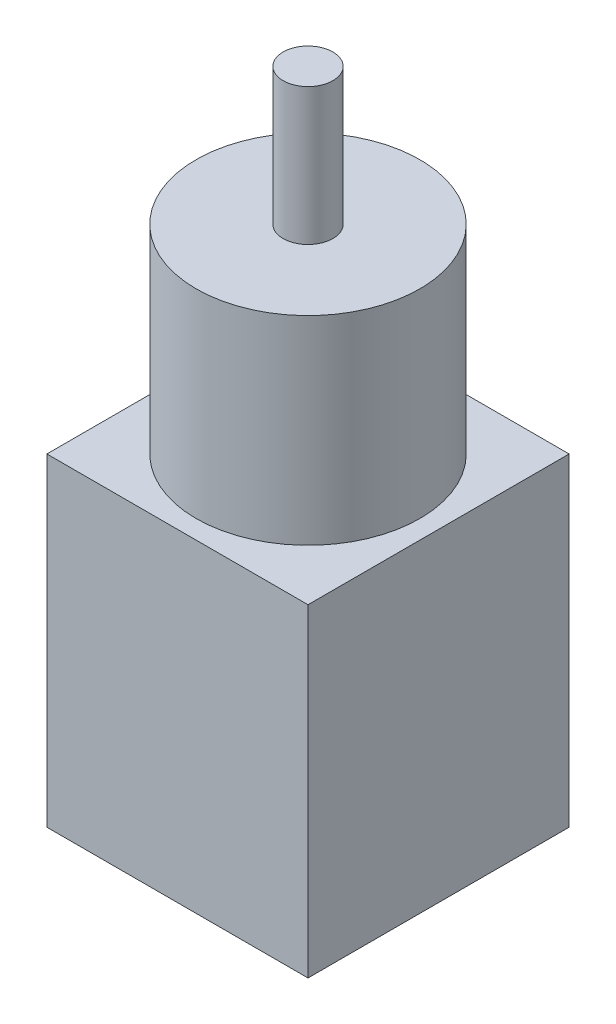
ISO-10303-21;
HEADER;
FILE_DESCRIPTION(('STEP AP214'),'2;1');
FILE_NAME('part.step','',(''),(''),'','','');
FILE_SCHEMA(('AUTOMOTIVE_DESIGN { 1 0 10303 214 1 1 1 1 }'));
ENDSEC;
DATA;
#1=APPLICATION_CONTEXT('core data for automotive mechanical design processes');
#2=APPLICATION_PROTOCOL_DEFINITION('international standard','automotive_design',2000,#1);
#3=PRODUCT_CONTEXT('',#1,'mechanical');
#4=PRODUCT('Part','Part','',(#3));
#5=PRODUCT_RELATED_PRODUCT_CATEGORY('part','',(#4));
#6=PRODUCT_DEFINITION_FORMATION('','',#4);
#7=PRODUCT_DEFINITION_CONTEXT('part definition',#1,'design');
#8=PRODUCT_DEFINITION('design','',#6,#7);
#9=PRODUCT_DEFINITION_SHAPE('','',#8);
#10=(LENGTH_UNIT() NAMED_UNIT(*) SI_UNIT(.MILLI.,.METRE.));
#11=(NAMED_UNIT(*) PLANE_ANGLE_UNIT() SI_UNIT($,.RADIAN.));
#12=(NAMED_UNIT(*) SI_UNIT($,.STERADIAN.) SOLID_ANGLE_UNIT());
#13=UNCERTAINTY_MEASURE_WITH_UNIT(LENGTH_MEASURE(1.E-05),#10,'distance_accuracy_value','');
#14=(GEOMETRIC_REPRESENTATION_CONTEXT(3) GLOBAL_UNCERTAINTY_ASSIGNED_CONTEXT((#13)) GLOBAL_UNIT_ASSIGNED_CONTEXT((#10,
#11,#12)) REPRESENTATION_CONTEXT('',''));
#15=CARTESIAN_POINT('',(0.,0.,0.));
#16=DIRECTION('',(0.,0.,1.));
#17=DIRECTION('',(1.,0.,0.));
#18=AXIS2_PLACEMENT_3D('',#15,#16,#17);
#19=CARTESIAN_POINT('',(21.,52.,21.));
#20=DIRECTION('',(-1.,0.,0.));
#21=DIRECTION('',(0.,0.,1.));
#22=AXIS2_PLACEMENT_3D('',#19,#20,#21);
#23=PLANE('',#22);
#24=DIRECTION('',(0.,0.,-1.));
#25=VECTOR('',#24,1.);
#26=CARTESIAN_POINT('',(21.,0.,21.));
#27=LINE('',#26,#25);
#28=CARTESIAN_POINT('',(21.,0.,21.));
#29=VERTEX_POINT('',#28);
#30=CARTESIAN_POINT('',(21.,0.,-21.));
#31=VERTEX_POINT('',#30);
#32=EDGE_CURVE('E100',#29,#31,#27,.T.);
#33=ORIENTED_EDGE('',*,*,#32,.T.);
#34=DIRECTION('',(0.,-1.,0.));
#35=VECTOR('',#34,1.);
#36=CARTESIAN_POINT('',(21.,52.,-21.));
#37=LINE('',#36,#35);
#38=CARTESIAN_POINT('',(21.,52.,-21.));
#39=VERTEX_POINT('',#38);
#40=EDGE_CURVE('E36',#39,#31,#37,.T.);
#41=ORIENTED_EDGE('',*,*,#40,.F.);
#42=DIRECTION('',(0.,0.,-1.));
#43=VECTOR('',#42,1.);
#44=CARTESIAN_POINT('',(21.,52.,21.));
#45=LINE('',#44,#43);
#46=CARTESIAN_POINT('',(21.,52.,21.));
#47=VERTEX_POINT('',#46);
#48=EDGE_CURVE('E87',#47,#39,#45,.T.);
#49=ORIENTED_EDGE('',*,*,#48,.F.);
#50=DIRECTION('',(0.,-1.,0.));
#51=VECTOR('',#50,1.);
#52=CARTESIAN_POINT('',(21.,52.,21.));
#53=LINE('',#52,#51);
#54=EDGE_CURVE('E96',#47,#29,#53,.T.);
#55=ORIENTED_EDGE('',*,*,#54,.T.);
#56=EDGE_LOOP('',(#33,#41,#49,#55));
#57=FACE_BOUND('',#56,.T.);
#58=ADVANCED_FACE('F33',(#57),#23,.F.);
#59=CARTESIAN_POINT('',(-21.,52.,-21.));
#60=DIRECTION('',(0.,0.,1.));
#61=DIRECTION('',(1.,0.,0.));
#62=AXIS2_PLACEMENT_3D('',#59,#60,#61);
#63=PLANE('',#62);
#64=DIRECTION('',(-1.,0.,0.));
#65=VECTOR('',#64,1.);
#66=CARTESIAN_POINT('',(-21.,0.,-21.));
#67=LINE('',#66,#65);
#68=CARTESIAN_POINT('',(-21.,0.,-21.));
#69=VERTEX_POINT('',#68);
#70=EDGE_CURVE('E92',#31,#69,#67,.T.);
#71=ORIENTED_EDGE('',*,*,#70,.T.);
#72=DIRECTION('',(0.,-1.,0.));
#73=VECTOR('',#72,1.);
#74=CARTESIAN_POINT('',(-21.,52.,-21.));
#75=LINE('',#74,#73);
#76=CARTESIAN_POINT('',(-21.,52.,-21.));
#77=VERTEX_POINT('',#76);
#78=EDGE_CURVE('E90',#77,#69,#75,.T.);
#79=ORIENTED_EDGE('',*,*,#78,.F.);
#80=DIRECTION('',(-1.,0.,0.));
#81=VECTOR('',#80,1.);
#82=CARTESIAN_POINT('',(-21.,52.,-21.));
#83=LINE('',#82,#81);
#84=EDGE_CURVE('E82',#39,#77,#83,.T.);
#85=ORIENTED_EDGE('',*,*,#84,.F.);
#86=ORIENTED_EDGE('',*,*,#40,.T.);
#87=EDGE_LOOP('',(#71,#79,#85,#86));
#88=FACE_BOUND('',#87,.T.);
#89=ADVANCED_FACE('F91',(#88),#63,.F.);
#90=CARTESIAN_POINT('',(-21.,52.,21.));
#91=DIRECTION('',(1.,0.,0.));
#92=DIRECTION('',(0.,0.,-1.));
#93=AXIS2_PLACEMENT_3D('',#90,#91,#92);
#94=PLANE('',#93);
#95=DIRECTION('',(0.,0.,1.));
#96=VECTOR('',#95,1.);
#97=CARTESIAN_POINT('',(-21.,0.,21.));
#98=LINE('',#97,#96);
#99=CARTESIAN_POINT('',(-21.,0.,21.));
#100=VERTEX_POINT('',#99);
#101=EDGE_CURVE('E68',#69,#100,#98,.T.);
#102=ORIENTED_EDGE('',*,*,#101,.T.);
#103=DIRECTION('',(0.,-1.,0.));
#104=VECTOR('',#103,1.);
#105=CARTESIAN_POINT('',(-21.,52.,21.));
#106=LINE('',#105,#104);
#107=CARTESIAN_POINT('',(-21.,52.,21.));
#108=VERTEX_POINT('',#107);
#109=EDGE_CURVE('E93',#108,#100,#106,.T.);
#110=ORIENTED_EDGE('',*,*,#109,.F.);
#111=DIRECTION('',(0.,0.,1.));
#112=VECTOR('',#111,1.);
#113=CARTESIAN_POINT('',(-21.,52.,21.));
#114=LINE('',#113,#112);
#115=EDGE_CURVE('E85',#77,#108,#114,.T.);
#116=ORIENTED_EDGE('',*,*,#115,.F.);
#117=ORIENTED_EDGE('',*,*,#78,.T.);
#118=EDGE_LOOP('',(#102,#110,#116,#117));
#119=FACE_BOUND('',#118,.T.);
#120=ADVANCED_FACE('F94',(#119),#94,.F.);
#121=CARTESIAN_POINT('',(-21.,52.,21.));
#122=DIRECTION('',(0.,0.,-1.));
#123=DIRECTION('',(-1.,0.,0.));
#124=AXIS2_PLACEMENT_3D('',#121,#122,#123);
#125=PLANE('',#124);
#126=DIRECTION('',(1.,0.,0.));
#127=VECTOR('',#126,1.);
#128=CARTESIAN_POINT('',(-21.,0.,21.));
#129=LINE('',#128,#127);
#130=EDGE_CURVE('E74',#100,#29,#129,.T.);
#131=ORIENTED_EDGE('',*,*,#130,.T.);
#132=ORIENTED_EDGE('',*,*,#54,.F.);
#133=DIRECTION('',(1.,0.,0.));
#134=VECTOR('',#133,1.);
#135=CARTESIAN_POINT('',(-21.,52.,21.));
#136=LINE('',#135,#134);
#137=EDGE_CURVE('E51',#108,#47,#136,.T.);
#138=ORIENTED_EDGE('',*,*,#137,.F.);
#139=ORIENTED_EDGE('',*,*,#109,.T.);
#140=EDGE_LOOP('',(#131,#132,#138,#139));
#141=FACE_BOUND('',#140,.T.);
#142=ADVANCED_FACE('F108',(#141),#125,.F.);
#143=CARTESIAN_POINT('',(0.,52.,0.));
#144=DIRECTION('',(0.,-1.,0.));
#145=DIRECTION('',(0.,0.,-1.));
#146=AXIS2_PLACEMENT_3D('',#143,#144,#145);
#147=PLANE('',#146);
#148=CARTESIAN_POINT('',(0.,52.,0.));
#149=DIRECTION('',(0.,1.,0.));
#150=DIRECTION('',(0.,0.,1.));
#151=AXIS2_PLACEMENT_3D('',#148,#149,#150);
#152=CIRCLE('',#151,18.);
#153=CARTESIAN_POINT('',(0.,52.,18.));
#154=VERTEX_POINT('',#153);
#155=EDGE_CURVE('E42',#154,#154,#152,.T.);
#156=ORIENTED_EDGE('',*,*,#155,.F.);
#157=EDGE_LOOP('',(#156));
#158=FACE_BOUND('',#157,.T.);
#159=ORIENTED_EDGE('',*,*,#48,.T.);
#160=ORIENTED_EDGE('',*,*,#84,.T.);
#161=ORIENTED_EDGE('',*,*,#115,.T.);
#162=ORIENTED_EDGE('',*,*,#137,.T.);
#163=EDGE_LOOP('',(#159,#160,#161,#162));
#164=FACE_BOUND('',#163,.T.);
#165=ADVANCED_FACE('F83',(#158,#164),#147,.F.);
#166=CARTESIAN_POINT('',(0.,0.,0.));
#167=DIRECTION('',(0.,-1.,0.));
#168=DIRECTION('',(0.,0.,-1.));
#169=AXIS2_PLACEMENT_3D('',#166,#167,#168);
#170=PLANE('',#169);
#171=CARTESIAN_POINT('',(0.,0.,0.));
#172=DIRECTION('',(0.,-1.,0.));
#173=DIRECTION('',(0.,0.,-1.));
#174=AXIS2_PLACEMENT_3D('',#171,#172,#173);
#175=CIRCLE('',#174,2.5);
#176=CARTESIAN_POINT('',(0.,0.,-2.5));
#177=VERTEX_POINT('',#176);
#178=EDGE_CURVE('E122',#177,#177,#175,.T.);
#179=ORIENTED_EDGE('',*,*,#178,.F.);
#180=EDGE_LOOP('',(#179));
#181=FACE_BOUND('',#180,.T.);
#182=ORIENTED_EDGE('',*,*,#32,.F.);
#183=ORIENTED_EDGE('',*,*,#130,.F.);
#184=ORIENTED_EDGE('',*,*,#101,.F.);
#185=ORIENTED_EDGE('',*,*,#70,.F.);
#186=EDGE_LOOP('',(#182,#183,#184,#185));
#187=FACE_BOUND('',#186,.T.);
#188=ADVANCED_FACE('F111',(#181,#187),#170,.T.);
#189=CARTESIAN_POINT('',(0.,84.,0.));
#190=DIRECTION('',(0.,-1.,0.));
#191=DIRECTION('',(0.,0.,-1.));
#192=AXIS2_PLACEMENT_3D('',#189,#190,#191);
#193=CYLINDRICAL_SURFACE('',#192,18.);
#194=CARTESIAN_POINT('',(0.,84.,0.));
#195=DIRECTION('',(0.,1.,0.));
#196=DIRECTION('',(0.,0.,1.));
#197=AXIS2_PLACEMENT_3D('',#194,#195,#196);
#198=CIRCLE('',#197,18.);
#199=CARTESIAN_POINT('',(0.,84.,18.));
#200=VERTEX_POINT('',#199);
#201=EDGE_CURVE('E103',#200,#200,#198,.T.);
#202=ORIENTED_EDGE('',*,*,#201,.F.);
#203=EDGE_LOOP('',(#202));
#204=FACE_BOUND('',#203,.T.);
#205=ORIENTED_EDGE('',*,*,#155,.T.);
#206=EDGE_LOOP('',(#205));
#207=FACE_BOUND('',#206,.T.);
#208=ADVANCED_FACE('F138',(#204,#207),#193,.T.);
#209=CARTESIAN_POINT('',(0.,84.,0.));
#210=DIRECTION('',(0.,1.,0.));
#211=DIRECTION('',(0.,0.,1.));
#212=AXIS2_PLACEMENT_3D('',#209,#210,#211);
#213=PLANE('',#212);
#214=CARTESIAN_POINT('',(0.,84.,0.));
#215=DIRECTION('',(0.,1.,0.));
#216=DIRECTION('',(0.,0.,1.));
#217=AXIS2_PLACEMENT_3D('',#214,#215,#216);
#218=CIRCLE('',#217,4.);
#219=CARTESIAN_POINT('',(0.,84.,4.));
#220=VERTEX_POINT('',#219);
#221=EDGE_CURVE('E11',#220,#220,#218,.T.);
#222=ORIENTED_EDGE('',*,*,#221,.F.);
#223=EDGE_LOOP('',(#222));
#224=FACE_BOUND('',#223,.T.);
#225=ORIENTED_EDGE('',*,*,#201,.T.);
#226=EDGE_LOOP('',(#225));
#227=FACE_BOUND('',#226,.T.);
#228=ADVANCED_FACE('F144',(#224,#227),#213,.T.);
#229=CARTESIAN_POINT('',(0.,106.,0.));
#230=DIRECTION('',(0.,-1.,0.));
#231=DIRECTION('',(0.,0.,-1.));
#232=AXIS2_PLACEMENT_3D('',#229,#230,#231);
#233=CYLINDRICAL_SURFACE('',#232,4.);
#234=CARTESIAN_POINT('',(0.,106.,0.));
#235=DIRECTION('',(0.,1.,0.));
#236=DIRECTION('',(0.,0.,1.));
#237=AXIS2_PLACEMENT_3D('',#234,#235,#236);
#238=CIRCLE('',#237,4.);
#239=CARTESIAN_POINT('',(0.,106.,4.));
#240=VERTEX_POINT('',#239);
#241=EDGE_CURVE('E117',#240,#240,#238,.T.);
#242=ORIENTED_EDGE('',*,*,#241,.F.);
#243=EDGE_LOOP('',(#242));
#244=FACE_BOUND('',#243,.T.);
#245=ORIENTED_EDGE('',*,*,#221,.T.);
#246=EDGE_LOOP('',(#245));
#247=FACE_BOUND('',#246,.T.);
#248=ADVANCED_FACE('F183',(#244,#247),#233,.T.);
#249=CARTESIAN_POINT('',(0.,106.,0.));
#250=DIRECTION('',(0.,1.,0.));
#251=DIRECTION('',(0.,0.,1.));
#252=AXIS2_PLACEMENT_3D('',#249,#250,#251);
#253=PLANE('',#252);
#254=ORIENTED_EDGE('',*,*,#241,.T.);
#255=EDGE_LOOP('',(#254));
#256=FACE_BOUND('',#255,.T.);
#257=ADVANCED_FACE('F133',(#256),#253,.T.);
#258=CARTESIAN_POINT('',(0.,-11.,0.));
#259=DIRECTION('',(0.,1.,0.));
#260=DIRECTION('',(0.,0.,1.));
#261=AXIS2_PLACEMENT_3D('',#258,#259,#260);
#262=CYLINDRICAL_SURFACE('',#261,2.5);
#263=CARTESIAN_POINT('',(0.,-11.,0.));
#264=DIRECTION('',(0.,-1.,0.));
#265=DIRECTION('',(0.,0.,-1.));
#266=AXIS2_PLACEMENT_3D('',#263,#264,#265);
#267=CIRCLE('',#266,2.5);
#268=CARTESIAN_POINT('',(0.,-11.,-2.5));
#269=VERTEX_POINT('',#268);
#270=EDGE_CURVE('E121',#269,#269,#267,.T.);
#271=ORIENTED_EDGE('',*,*,#270,.F.);
#272=EDGE_LOOP('',(#271));
#273=FACE_BOUND('',#272,.T.);
#274=ORIENTED_EDGE('',*,*,#178,.T.);
#275=EDGE_LOOP('',(#274));
#276=FACE_BOUND('',#275,.T.);
#277=ADVANCED_FACE('F130',(#273,#276),#262,.T.);
#278=CARTESIAN_POINT('',(0.,-11.,0.));
#279=DIRECTION('',(0.,-1.,0.));
#280=DIRECTION('',(0.,0.,-1.));
#281=AXIS2_PLACEMENT_3D('',#278,#279,#280);
#282=PLANE('',#281);
#283=ORIENTED_EDGE('',*,*,#270,.T.);
#284=EDGE_LOOP('',(#283));
#285=FACE_BOUND('',#284,.T.);
#286=ADVANCED_FACE('F128',(#285),#282,.T.);
#287=CLOSED_SHELL('',(#58,#89,#120,#142,#165,#188,#208,#228,#248,#257,#277,#286));
#288=MANIFOLD_SOLID_BREP('B2',#287);
#289=ADVANCED_BREP_SHAPE_REPRESENTATION('',(#18,#288),#14);
#290=SHAPE_DEFINITION_REPRESENTATION(#9,#289);
ENDSEC;
END-ISO-10303-21;
